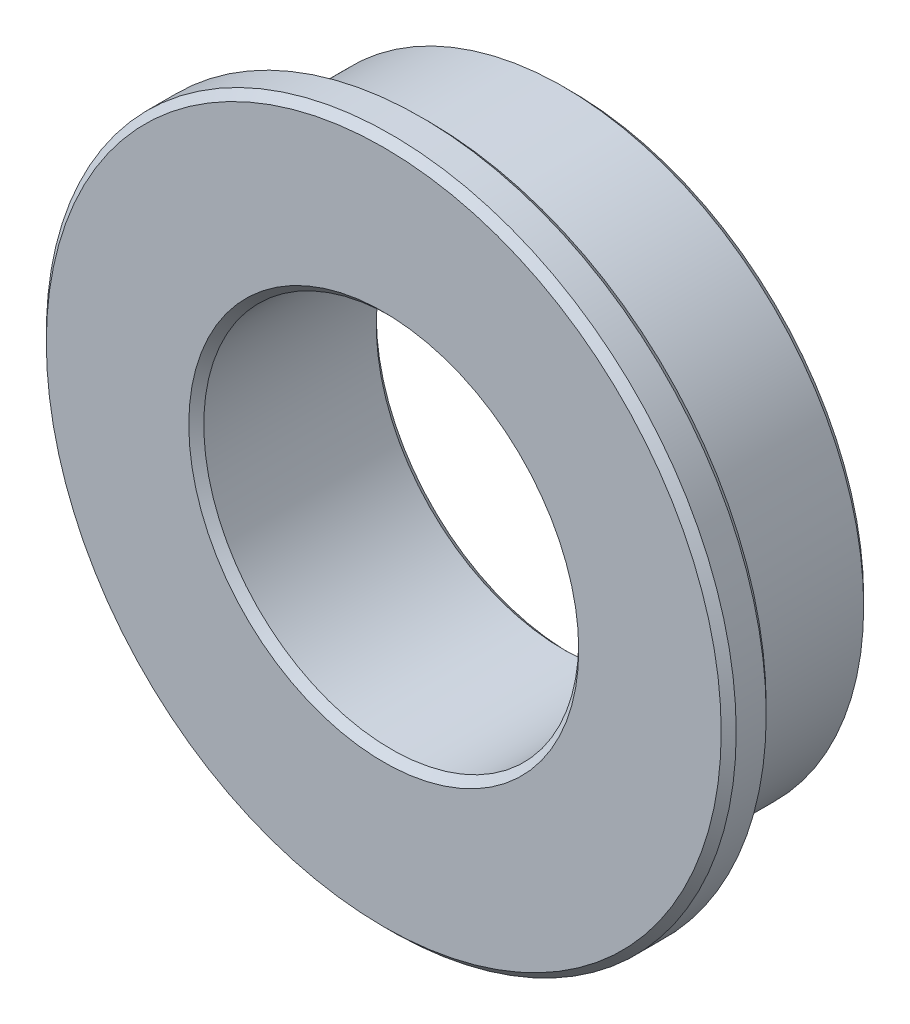
ISO-10303-21;
HEADER;
FILE_DESCRIPTION(('STEP AP214'),'2;1');
FILE_NAME('part.step','',(''),(''),'','','');
FILE_SCHEMA(('AUTOMOTIVE_DESIGN { 1 0 10303 214 1 1 1 1 }'));
ENDSEC;
DATA;
#1=APPLICATION_CONTEXT('core data for automotive mechanical design processes');
#2=APPLICATION_PROTOCOL_DEFINITION('international standard','automotive_design',2000,#1);
#3=PRODUCT_CONTEXT('',#1,'mechanical');
#4=PRODUCT('Part','Part','',(#3));
#5=PRODUCT_RELATED_PRODUCT_CATEGORY('part','',(#4));
#6=PRODUCT_DEFINITION_FORMATION('','',#4);
#7=PRODUCT_DEFINITION_CONTEXT('part definition',#1,'design');
#8=PRODUCT_DEFINITION('design','',#6,#7);
#9=PRODUCT_DEFINITION_SHAPE('','',#8);
#10=(LENGTH_UNIT() NAMED_UNIT(*) SI_UNIT(.MILLI.,.METRE.));
#11=(NAMED_UNIT(*) PLANE_ANGLE_UNIT() SI_UNIT($,.RADIAN.));
#12=(NAMED_UNIT(*) SI_UNIT($,.STERADIAN.) SOLID_ANGLE_UNIT());
#13=UNCERTAINTY_MEASURE_WITH_UNIT(LENGTH_MEASURE(1.E-05),#10,'distance_accuracy_value','');
#14=(GEOMETRIC_REPRESENTATION_CONTEXT(3) GLOBAL_UNCERTAINTY_ASSIGNED_CONTEXT((#13)) GLOBAL_UNIT_ASSIGNED_CONTEXT((#10,
#11,#12)) REPRESENTATION_CONTEXT('',''));
#15=CARTESIAN_POINT('',(0.,0.,0.));
#16=DIRECTION('',(0.,0.,1.));
#17=DIRECTION('',(1.,0.,0.));
#18=AXIS2_PLACEMENT_3D('',#15,#16,#17);
#19=CARTESIAN_POINT('',(0.,0.,2.5));
#20=DIRECTION('',(0.,0.,-1.));
#21=DIRECTION('',(-1.,0.,0.));
#22=AXIS2_PLACEMENT_3D('',#19,#20,#21);
#23=CYLINDRICAL_SURFACE('',#22,4.);
#24=CARTESIAN_POINT('',(0.,0.,0.1));
#25=DIRECTION('',(0.,0.,1.));
#26=DIRECTION('',(1.,0.,0.));
#27=AXIS2_PLACEMENT_3D('',#24,#25,#26);
#28=CIRCLE('',#27,4.);
#29=CARTESIAN_POINT('',(4.,0.,0.1));
#30=VERTEX_POINT('',#29);
#31=EDGE_CURVE('E69',#30,#30,#28,.T.);
#32=ORIENTED_EDGE('',*,*,#31,.T.);
#33=EDGE_LOOP('',(#32));
#34=FACE_BOUND('',#33,.T.);
#35=CARTESIAN_POINT('',(0.,0.,1.9));
#36=DIRECTION('',(0.,0.,1.));
#37=DIRECTION('',(1.,0.,0.));
#38=AXIS2_PLACEMENT_3D('',#35,#36,#37);
#39=CIRCLE('',#38,4.);
#40=CARTESIAN_POINT('',(4.,0.,1.9));
#41=VERTEX_POINT('',#40);
#42=EDGE_CURVE('E72',#41,#41,#39,.T.);
#43=ORIENTED_EDGE('',*,*,#42,.F.);
#44=EDGE_LOOP('',(#43));
#45=FACE_BOUND('',#44,.T.);
#46=ADVANCED_FACE('F34',(#34,#45),#23,.T.);
#47=CARTESIAN_POINT('',(0.,0.,2.5));
#48=DIRECTION('',(0.,0.,1.));
#49=DIRECTION('',(1.,0.,0.));
#50=AXIS2_PLACEMENT_3D('',#47,#48,#49);
#51=PLANE('',#50);
#52=CARTESIAN_POINT('',(0.,0.,2.5));
#53=DIRECTION('',(0.,0.,1.));
#54=DIRECTION('',(1.,0.,0.));
#55=AXIS2_PLACEMENT_3D('',#52,#53,#54);
#56=CIRCLE('',#55,2.6);
#57=CARTESIAN_POINT('',(2.6,0.,2.5));
#58=VERTEX_POINT('',#57);
#59=EDGE_CURVE('E49',#58,#58,#56,.F.);
#60=ORIENTED_EDGE('',*,*,#59,.T.);
#61=EDGE_LOOP('',(#60));
#62=FACE_BOUND('',#61,.T.);
#63=CARTESIAN_POINT('',(0.,0.,2.5));
#64=DIRECTION('',(0.,0.,1.));
#65=DIRECTION('',(1.,0.,0.));
#66=AXIS2_PLACEMENT_3D('',#63,#64,#65);
#67=CIRCLE('',#66,4.5);
#68=CARTESIAN_POINT('',(4.5,0.,2.5));
#69=VERTEX_POINT('',#68);
#70=EDGE_CURVE('E54',#69,#69,#67,.T.);
#71=ORIENTED_EDGE('',*,*,#70,.T.);
#72=EDGE_LOOP('',(#71));
#73=FACE_BOUND('',#72,.T.);
#74=ADVANCED_FACE('F79',(#62,#73),#51,.T.);
#75=CARTESIAN_POINT('',(0.,0.,0.));
#76=DIRECTION('',(0.,0.,1.));
#77=DIRECTION('',(1.,0.,0.));
#78=AXIS2_PLACEMENT_3D('',#75,#76,#77);
#79=PLANE('',#78);
#80=CARTESIAN_POINT('',(0.,0.,0.));
#81=DIRECTION('',(0.,0.,1.));
#82=DIRECTION('',(1.,0.,0.));
#83=AXIS2_PLACEMENT_3D('',#80,#81,#82);
#84=CIRCLE('',#83,3.9);
#85=CARTESIAN_POINT('',(3.9,0.,0.));
#86=VERTEX_POINT('',#85);
#87=EDGE_CURVE('E63',#86,#86,#84,.F.);
#88=ORIENTED_EDGE('',*,*,#87,.T.);
#89=EDGE_LOOP('',(#88));
#90=FACE_BOUND('',#89,.T.);
#91=CARTESIAN_POINT('',(0.,0.,0.));
#92=DIRECTION('',(0.,0.,1.));
#93=DIRECTION('',(1.,0.,0.));
#94=AXIS2_PLACEMENT_3D('',#91,#92,#93);
#95=CIRCLE('',#94,2.6);
#96=CARTESIAN_POINT('',(2.6,0.,0.));
#97=VERTEX_POINT('',#96);
#98=EDGE_CURVE('E66',#97,#97,#95,.T.);
#99=ORIENTED_EDGE('',*,*,#98,.T.);
#100=EDGE_LOOP('',(#99));
#101=FACE_BOUND('',#100,.T.);
#102=ADVANCED_FACE('F85',(#90,#101),#79,.F.);
#103=CARTESIAN_POINT('',(0.,0.,2.5));
#104=DIRECTION('',(0.,0.,-1.));
#105=DIRECTION('',(-1.,0.,0.));
#106=AXIS2_PLACEMENT_3D('',#103,#104,#105);
#107=CYLINDRICAL_SURFACE('',#106,2.5);
#108=CARTESIAN_POINT('',(0.,0.,0.0999999999999994));
#109=DIRECTION('',(0.,0.,1.));
#110=DIRECTION('',(1.,0.,0.));
#111=AXIS2_PLACEMENT_3D('',#108,#109,#110);
#112=CIRCLE('',#111,2.5);
#113=CARTESIAN_POINT('',(2.5,0.,0.0999999999999994));
#114=VERTEX_POINT('',#113);
#115=EDGE_CURVE('E57',#114,#114,#112,.F.);
#116=ORIENTED_EDGE('',*,*,#115,.T.);
#117=EDGE_LOOP('',(#116));
#118=FACE_BOUND('',#117,.T.);
#119=CARTESIAN_POINT('',(0.,0.,2.4));
#120=DIRECTION('',(0.,0.,1.));
#121=DIRECTION('',(1.,0.,0.));
#122=AXIS2_PLACEMENT_3D('',#119,#120,#121);
#123=CIRCLE('',#122,2.5);
#124=CARTESIAN_POINT('',(2.5,0.,2.4));
#125=VERTEX_POINT('',#124);
#126=EDGE_CURVE('E60',#125,#125,#123,.T.);
#127=ORIENTED_EDGE('',*,*,#126,.T.);
#128=EDGE_LOOP('',(#127));
#129=FACE_BOUND('',#128,.T.);
#130=ADVANCED_FACE('F118',(#118,#129),#107,.F.);
#131=CARTESIAN_POINT('',(0.,0.,1.9));
#132=DIRECTION('',(0.,0.,1.));
#133=DIRECTION('',(1.,0.,0.));
#134=AXIS2_PLACEMENT_3D('',#131,#132,#133);
#135=CYLINDRICAL_SURFACE('',#134,4.6);
#136=CARTESIAN_POINT('',(0.,0.,2.4));
#137=DIRECTION('',(0.,0.,1.));
#138=DIRECTION('',(1.,0.,0.));
#139=AXIS2_PLACEMENT_3D('',#136,#137,#138);
#140=CIRCLE('',#139,4.6);
#141=CARTESIAN_POINT('',(4.6,0.,2.4));
#142=VERTEX_POINT('',#141);
#143=EDGE_CURVE('E41',#142,#142,#140,.F.);
#144=ORIENTED_EDGE('',*,*,#143,.T.);
#145=EDGE_LOOP('',(#144));
#146=FACE_BOUND('',#145,.T.);
#147=CARTESIAN_POINT('',(0.,0.,2.));
#148=DIRECTION('',(0.,0.,1.));
#149=DIRECTION('',(1.,0.,0.));
#150=AXIS2_PLACEMENT_3D('',#147,#148,#149);
#151=CIRCLE('',#150,4.6);
#152=CARTESIAN_POINT('',(4.6,0.,2.));
#153=VERTEX_POINT('',#152);
#154=EDGE_CURVE('E45',#153,#153,#151,.T.);
#155=ORIENTED_EDGE('',*,*,#154,.T.);
#156=EDGE_LOOP('',(#155));
#157=FACE_BOUND('',#156,.T.);
#158=ADVANCED_FACE('F116',(#146,#157),#135,.T.);
#159=CARTESIAN_POINT('',(0.,0.,1.9));
#160=DIRECTION('',(0.,0.,1.));
#161=DIRECTION('',(1.,0.,0.));
#162=AXIS2_PLACEMENT_3D('',#159,#160,#161);
#163=PLANE('',#162);
#164=CARTESIAN_POINT('',(0.,0.,1.9));
#165=DIRECTION('',(0.,0.,1.));
#166=DIRECTION('',(1.,0.,0.));
#167=AXIS2_PLACEMENT_3D('',#164,#165,#166);
#168=CIRCLE('',#167,4.5);
#169=CARTESIAN_POINT('',(4.5,0.,1.9));
#170=VERTEX_POINT('',#169);
#171=EDGE_CURVE('E10',#170,#170,#168,.F.);
#172=ORIENTED_EDGE('',*,*,#171,.T.);
#173=EDGE_LOOP('',(#172));
#174=FACE_BOUND('',#173,.T.);
#175=ORIENTED_EDGE('',*,*,#42,.T.);
#176=EDGE_LOOP('',(#175));
#177=FACE_BOUND('',#176,.T.);
#178=ADVANCED_FACE('F76',(#174,#177),#163,.F.);
#179=CARTESIAN_POINT('',(0.,0.,0.1));
#180=DIRECTION('',(0.,0.,1.));
#181=DIRECTION('',(1.,0.,0.));
#182=AXIS2_PLACEMENT_3D('',#179,#180,#181);
#183=CONICAL_SURFACE('',#182,4.,0.785398163397457);
#184=ORIENTED_EDGE('',*,*,#87,.F.);
#185=EDGE_LOOP('',(#184));
#186=FACE_BOUND('',#185,.T.);
#187=ORIENTED_EDGE('',*,*,#31,.F.);
#188=EDGE_LOOP('',(#187));
#189=FACE_BOUND('',#188,.T.);
#190=ADVANCED_FACE('F90',(#186,#189),#183,.T.);
#191=CARTESIAN_POINT('',(0.,0.,0.));
#192=DIRECTION('',(0.,0.,-1.));
#193=DIRECTION('',(-1.,0.,0.));
#194=AXIS2_PLACEMENT_3D('',#191,#192,#193);
#195=CONICAL_SURFACE('',#194,2.6,0.785398163397446);
#196=ORIENTED_EDGE('',*,*,#115,.F.);
#197=EDGE_LOOP('',(#196));
#198=FACE_BOUND('',#197,.T.);
#199=ORIENTED_EDGE('',*,*,#98,.F.);
#200=EDGE_LOOP('',(#199));
#201=FACE_BOUND('',#200,.T.);
#202=ADVANCED_FACE('F93',(#198,#201),#195,.F.);
#203=CARTESIAN_POINT('',(0.,0.,2.4));
#204=DIRECTION('',(0.,0.,1.));
#205=DIRECTION('',(1.,0.,0.));
#206=AXIS2_PLACEMENT_3D('',#203,#204,#205);
#207=CONICAL_SURFACE('',#206,2.5,0.78539816339745);
#208=ORIENTED_EDGE('',*,*,#59,.F.);
#209=EDGE_LOOP('',(#208));
#210=FACE_BOUND('',#209,.T.);
#211=ORIENTED_EDGE('',*,*,#126,.F.);
#212=EDGE_LOOP('',(#211));
#213=FACE_BOUND('',#212,.T.);
#214=ADVANCED_FACE('F97',(#210,#213),#207,.F.);
#215=CARTESIAN_POINT('',(0.,0.,2.5));
#216=DIRECTION('',(0.,0.,-1.));
#217=DIRECTION('',(-1.,0.,0.));
#218=AXIS2_PLACEMENT_3D('',#215,#216,#217);
#219=CONICAL_SURFACE('',#218,4.5,0.785398163397446);
#220=ORIENTED_EDGE('',*,*,#143,.F.);
#221=EDGE_LOOP('',(#220));
#222=FACE_BOUND('',#221,.T.);
#223=ORIENTED_EDGE('',*,*,#70,.F.);
#224=EDGE_LOOP('',(#223));
#225=FACE_BOUND('',#224,.T.);
#226=ADVANCED_FACE('F100',(#222,#225),#219,.T.);
#227=CARTESIAN_POINT('',(0.,0.,2.));
#228=DIRECTION('',(0.,0.,1.));
#229=DIRECTION('',(1.,0.,0.));
#230=AXIS2_PLACEMENT_3D('',#227,#228,#229);
#231=CONICAL_SURFACE('',#230,4.6,0.785398163397455);
#232=ORIENTED_EDGE('',*,*,#171,.F.);
#233=EDGE_LOOP('',(#232));
#234=FACE_BOUND('',#233,.T.);
#235=ORIENTED_EDGE('',*,*,#154,.F.);
#236=EDGE_LOOP('',(#235));
#237=FACE_BOUND('',#236,.T.);
#238=ADVANCED_FACE('F36',(#234,#237),#231,.T.);
#239=CLOSED_SHELL('',(#46,#74,#102,#130,#158,#178,#190,#202,#214,#226,#238));
#240=MANIFOLD_SOLID_BREP('B2',#239);
#241=ADVANCED_BREP_SHAPE_REPRESENTATION('',(#18,#240),#14);
#242=SHAPE_DEFINITION_REPRESENTATION(#9,#241);
ENDSEC;
END-ISO-10303-21;
